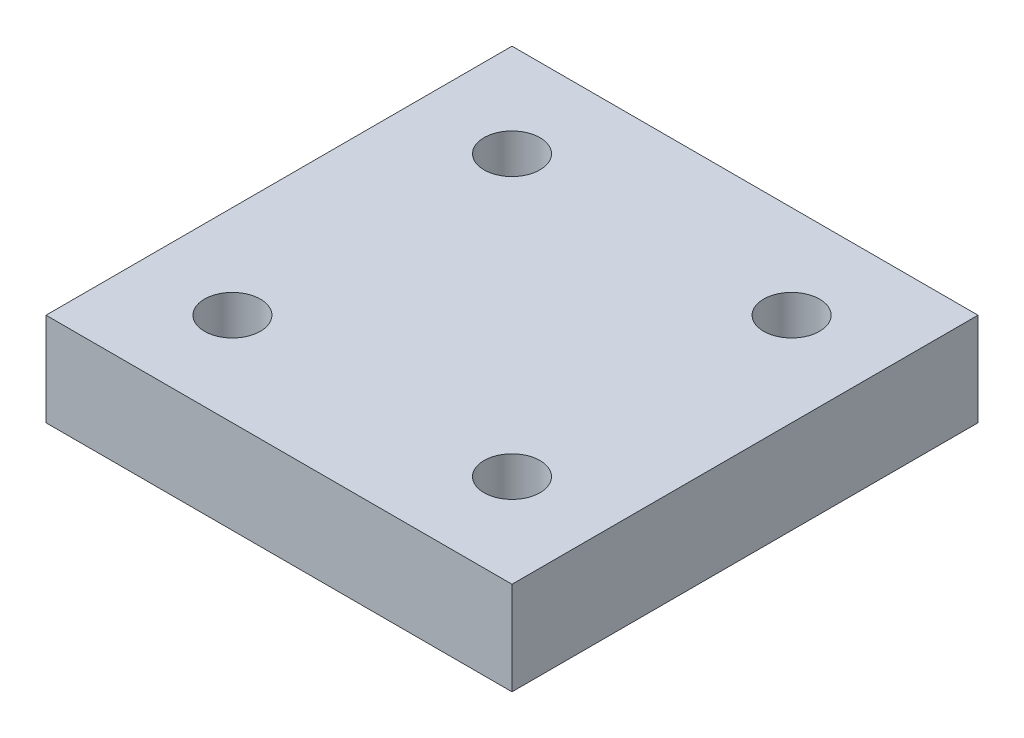
ISO-10303-21;
HEADER;
FILE_DESCRIPTION(('STEP AP214'),'2;1');
FILE_NAME('part.step','',(''),(''),'','','');
FILE_SCHEMA(('AUTOMOTIVE_DESIGN { 1 0 10303 214 1 1 1 1 }'));
ENDSEC;
DATA;
#1=APPLICATION_CONTEXT('core data for automotive mechanical design processes');
#2=APPLICATION_PROTOCOL_DEFINITION('international standard','automotive_design',2000,#1);
#3=PRODUCT_CONTEXT('',#1,'mechanical');
#4=PRODUCT('Part','Part','',(#3));
#5=PRODUCT_RELATED_PRODUCT_CATEGORY('part','',(#4));
#6=PRODUCT_DEFINITION_FORMATION('','',#4);
#7=PRODUCT_DEFINITION_CONTEXT('part definition',#1,'design');
#8=PRODUCT_DEFINITION('design','',#6,#7);
#9=PRODUCT_DEFINITION_SHAPE('','',#8);
#10=(LENGTH_UNIT() NAMED_UNIT(*) SI_UNIT(.MILLI.,.METRE.));
#11=(NAMED_UNIT(*) PLANE_ANGLE_UNIT() SI_UNIT($,.RADIAN.));
#12=(NAMED_UNIT(*) SI_UNIT($,.STERADIAN.) SOLID_ANGLE_UNIT());
#13=UNCERTAINTY_MEASURE_WITH_UNIT(LENGTH_MEASURE(1.E-05),#10,'distance_accuracy_value','');
#14=(GEOMETRIC_REPRESENTATION_CONTEXT(3) GLOBAL_UNCERTAINTY_ASSIGNED_CONTEXT((#13)) GLOBAL_UNIT_ASSIGNED_CONTEXT((#10,
#11,#12)) REPRESENTATION_CONTEXT('',''));
#15=CARTESIAN_POINT('',(0.,0.,0.));
#16=DIRECTION('',(0.,0.,1.));
#17=DIRECTION('',(1.,0.,0.));
#18=AXIS2_PLACEMENT_3D('',#15,#16,#17);
#19=CARTESIAN_POINT('',(0.,10.,0.));
#20=DIRECTION('',(0.,1.,0.));
#21=DIRECTION('',(0.,0.,1.));
#22=AXIS2_PLACEMENT_3D('',#19,#20,#21);
#23=PLANE('',#22);
#24=CARTESIAN_POINT('',(15.0000000000003,10.,15.));
#25=DIRECTION('',(0.,1.,0.));
#26=DIRECTION('',(0.,0.,1.));
#27=AXIS2_PLACEMENT_3D('',#24,#25,#26);
#28=CIRCLE('',#27,3.);
#29=CARTESIAN_POINT('',(15.0000000000003,10.,18.));
#30=VERTEX_POINT('',#29);
#31=EDGE_CURVE('E122',#30,#30,#28,.T.);
#32=ORIENTED_EDGE('',*,*,#31,.F.);
#33=EDGE_LOOP('',(#32));
#34=FACE_BOUND('',#33,.T.);
#35=CARTESIAN_POINT('',(-15.,10.,-15.));
#36=DIRECTION('',(0.,1.,0.));
#37=DIRECTION('',(0.,0.,1.));
#38=AXIS2_PLACEMENT_3D('',#35,#36,#37);
#39=CIRCLE('',#38,3.);
#40=CARTESIAN_POINT('',(-15.,10.,-12.));
#41=VERTEX_POINT('',#40);
#42=EDGE_CURVE('E101',#41,#41,#39,.T.);
#43=ORIENTED_EDGE('',*,*,#42,.F.);
#44=EDGE_LOOP('',(#43));
#45=FACE_BOUND('',#44,.T.);
#46=DIRECTION('',(0.,0.,1.));
#47=VECTOR('',#46,1.);
#48=CARTESIAN_POINT('',(-25.,10.,25.));
#49=LINE('',#48,#47);
#50=CARTESIAN_POINT('',(-25.,10.,-25.));
#51=VERTEX_POINT('',#50);
#52=CARTESIAN_POINT('',(-25.,10.,25.));
#53=VERTEX_POINT('',#52);
#54=EDGE_CURVE('E86',#51,#53,#49,.T.);
#55=ORIENTED_EDGE('',*,*,#54,.T.);
#56=DIRECTION('',(1.,0.,0.));
#57=VECTOR('',#56,1.);
#58=CARTESIAN_POINT('',(25.,10.,25.));
#59=LINE('',#58,#57);
#60=CARTESIAN_POINT('',(25.,10.,25.));
#61=VERTEX_POINT('',#60);
#62=EDGE_CURVE('E81',#53,#61,#59,.T.);
#63=ORIENTED_EDGE('',*,*,#62,.T.);
#64=DIRECTION('',(0.,0.,-1.));
#65=VECTOR('',#64,1.);
#66=CARTESIAN_POINT('',(25.,10.,25.));
#67=LINE('',#66,#65);
#68=CARTESIAN_POINT('',(25.,10.,-25.));
#69=VERTEX_POINT('',#68);
#70=EDGE_CURVE('E84',#61,#69,#67,.T.);
#71=ORIENTED_EDGE('',*,*,#70,.T.);
#72=DIRECTION('',(-1.,0.,0.));
#73=VECTOR('',#72,1.);
#74=CARTESIAN_POINT('',(25.,10.,-25.));
#75=LINE('',#74,#73);
#76=EDGE_CURVE('E51',#69,#51,#75,.T.);
#77=ORIENTED_EDGE('',*,*,#76,.T.);
#78=EDGE_LOOP('',(#55,#63,#71,#77));
#79=FACE_BOUND('',#78,.T.);
#80=CARTESIAN_POINT('',(15.,10.,-15.));
#81=DIRECTION('',(0.,1.,0.));
#82=DIRECTION('',(0.,0.,1.));
#83=AXIS2_PLACEMENT_3D('',#80,#81,#82);
#84=CIRCLE('',#83,3.);
#85=CARTESIAN_POINT('',(15.,10.,-12.));
#86=VERTEX_POINT('',#85);
#87=EDGE_CURVE('E116',#86,#86,#84,.T.);
#88=ORIENTED_EDGE('',*,*,#87,.F.);
#89=EDGE_LOOP('',(#88));
#90=FACE_BOUND('',#89,.T.);
#91=CARTESIAN_POINT('',(-14.9999999999997,10.,15.));
#92=DIRECTION('',(0.,1.,0.));
#93=DIRECTION('',(0.,0.,1.));
#94=AXIS2_PLACEMENT_3D('',#91,#92,#93);
#95=CIRCLE('',#94,3.);
#96=CARTESIAN_POINT('',(-14.9999999999997,10.,18.));
#97=VERTEX_POINT('',#96);
#98=EDGE_CURVE('E128',#97,#97,#95,.T.);
#99=ORIENTED_EDGE('',*,*,#98,.F.);
#100=EDGE_LOOP('',(#99));
#101=FACE_BOUND('',#100,.T.);
#102=ADVANCED_FACE('F34',(#34,#45,#79,#90,#101),#23,.T.);
#103=CARTESIAN_POINT('',(0.,0.,0.));
#104=DIRECTION('',(0.,1.,0.));
#105=DIRECTION('',(0.,0.,1.));
#106=AXIS2_PLACEMENT_3D('',#103,#104,#105);
#107=PLANE('',#106);
#108=DIRECTION('',(0.,0.,1.));
#109=VECTOR('',#108,1.);
#110=CARTESIAN_POINT('',(-25.,0.,25.));
#111=LINE('',#110,#109);
#112=CARTESIAN_POINT('',(-25.,0.,-25.));
#113=VERTEX_POINT('',#112);
#114=CARTESIAN_POINT('',(-25.,0.,25.));
#115=VERTEX_POINT('',#114);
#116=EDGE_CURVE('E98',#113,#115,#111,.T.);
#117=ORIENTED_EDGE('',*,*,#116,.F.);
#118=DIRECTION('',(-1.,0.,0.));
#119=VECTOR('',#118,1.);
#120=CARTESIAN_POINT('',(25.,0.,-25.));
#121=LINE('',#120,#119);
#122=CARTESIAN_POINT('',(25.,0.,-25.));
#123=VERTEX_POINT('',#122);
#124=EDGE_CURVE('E74',#123,#113,#121,.T.);
#125=ORIENTED_EDGE('',*,*,#124,.F.);
#126=DIRECTION('',(0.,0.,-1.));
#127=VECTOR('',#126,1.);
#128=CARTESIAN_POINT('',(25.,0.,25.));
#129=LINE('',#128,#127);
#130=CARTESIAN_POINT('',(25.,0.,25.));
#131=VERTEX_POINT('',#130);
#132=EDGE_CURVE('E68',#131,#123,#129,.T.);
#133=ORIENTED_EDGE('',*,*,#132,.F.);
#134=DIRECTION('',(1.,0.,0.));
#135=VECTOR('',#134,1.);
#136=CARTESIAN_POINT('',(25.,0.,25.));
#137=LINE('',#136,#135);
#138=EDGE_CURVE('E90',#115,#131,#137,.T.);
#139=ORIENTED_EDGE('',*,*,#138,.F.);
#140=EDGE_LOOP('',(#117,#125,#133,#139));
#141=FACE_BOUND('',#140,.T.);
#142=CARTESIAN_POINT('',(-15.,0.,-15.));
#143=DIRECTION('',(0.,1.,0.));
#144=DIRECTION('',(0.,0.,1.));
#145=AXIS2_PLACEMENT_3D('',#142,#143,#144);
#146=CIRCLE('',#145,3.);
#147=CARTESIAN_POINT('',(-15.,0.,-12.));
#148=VERTEX_POINT('',#147);
#149=EDGE_CURVE('E113',#148,#148,#146,.T.);
#150=ORIENTED_EDGE('',*,*,#149,.T.);
#151=EDGE_LOOP('',(#150));
#152=FACE_BOUND('',#151,.T.);
#153=CARTESIAN_POINT('',(15.,0.,-15.));
#154=DIRECTION('',(0.,1.,0.));
#155=DIRECTION('',(0.,0.,1.));
#156=AXIS2_PLACEMENT_3D('',#153,#154,#155);
#157=CIRCLE('',#156,3.);
#158=CARTESIAN_POINT('',(15.,0.,-12.));
#159=VERTEX_POINT('',#158);
#160=EDGE_CURVE('E119',#159,#159,#157,.T.);
#161=ORIENTED_EDGE('',*,*,#160,.T.);
#162=EDGE_LOOP('',(#161));
#163=FACE_BOUND('',#162,.T.);
#164=CARTESIAN_POINT('',(15.0000000000003,0.,15.));
#165=DIRECTION('',(0.,1.,0.));
#166=DIRECTION('',(0.,0.,1.));
#167=AXIS2_PLACEMENT_3D('',#164,#165,#166);
#168=CIRCLE('',#167,3.);
#169=CARTESIAN_POINT('',(15.0000000000003,0.,18.));
#170=VERTEX_POINT('',#169);
#171=EDGE_CURVE('E125',#170,#170,#168,.T.);
#172=ORIENTED_EDGE('',*,*,#171,.T.);
#173=EDGE_LOOP('',(#172));
#174=FACE_BOUND('',#173,.T.);
#175=CARTESIAN_POINT('',(-14.9999999999997,0.,15.));
#176=DIRECTION('',(0.,1.,0.));
#177=DIRECTION('',(0.,0.,1.));
#178=AXIS2_PLACEMENT_3D('',#175,#176,#177);
#179=CIRCLE('',#178,3.);
#180=CARTESIAN_POINT('',(-14.9999999999997,0.,18.));
#181=VERTEX_POINT('',#180);
#182=EDGE_CURVE('E131',#181,#181,#179,.T.);
#183=ORIENTED_EDGE('',*,*,#182,.T.);
#184=EDGE_LOOP('',(#183));
#185=FACE_BOUND('',#184,.T.);
#186=ADVANCED_FACE('F109',(#141,#152,#163,#174,#185),#107,.F.);
#187=CARTESIAN_POINT('',(-25.,10.,25.));
#188=DIRECTION('',(1.,0.,0.));
#189=DIRECTION('',(0.,0.,-1.));
#190=AXIS2_PLACEMENT_3D('',#187,#188,#189);
#191=PLANE('',#190);
#192=ORIENTED_EDGE('',*,*,#116,.T.);
#193=DIRECTION('',(0.,-1.,0.));
#194=VECTOR('',#193,1.);
#195=CARTESIAN_POINT('',(-25.,10.,25.));
#196=LINE('',#195,#194);
#197=EDGE_CURVE('E11',#53,#115,#196,.T.);
#198=ORIENTED_EDGE('',*,*,#197,.F.);
#199=ORIENTED_EDGE('',*,*,#54,.F.);
#200=DIRECTION('',(0.,-1.,0.));
#201=VECTOR('',#200,1.);
#202=CARTESIAN_POINT('',(-25.,10.,-25.));
#203=LINE('',#202,#201);
#204=EDGE_CURVE('E94',#51,#113,#203,.T.);
#205=ORIENTED_EDGE('',*,*,#204,.T.);
#206=EDGE_LOOP('',(#192,#198,#199,#205));
#207=FACE_BOUND('',#206,.T.);
#208=ADVANCED_FACE('F36',(#207),#191,.F.);
#209=CARTESIAN_POINT('',(25.,10.,25.));
#210=DIRECTION('',(0.,0.,-1.));
#211=DIRECTION('',(-1.,0.,0.));
#212=AXIS2_PLACEMENT_3D('',#209,#210,#211);
#213=PLANE('',#212);
#214=ORIENTED_EDGE('',*,*,#138,.T.);
#215=DIRECTION('',(0.,-1.,0.));
#216=VECTOR('',#215,1.);
#217=CARTESIAN_POINT('',(25.,10.,25.));
#218=LINE('',#217,#216);
#219=EDGE_CURVE('E43',#61,#131,#218,.T.);
#220=ORIENTED_EDGE('',*,*,#219,.F.);
#221=ORIENTED_EDGE('',*,*,#62,.F.);
#222=ORIENTED_EDGE('',*,*,#197,.T.);
#223=EDGE_LOOP('',(#214,#220,#221,#222));
#224=FACE_BOUND('',#223,.T.);
#225=ADVANCED_FACE('F89',(#224),#213,.F.);
#226=CARTESIAN_POINT('',(25.,10.,25.));
#227=DIRECTION('',(-1.,0.,0.));
#228=DIRECTION('',(0.,0.,1.));
#229=AXIS2_PLACEMENT_3D('',#226,#227,#228);
#230=PLANE('',#229);
#231=ORIENTED_EDGE('',*,*,#132,.T.);
#232=DIRECTION('',(0.,-1.,0.));
#233=VECTOR('',#232,1.);
#234=CARTESIAN_POINT('',(25.,10.,-25.));
#235=LINE('',#234,#233);
#236=EDGE_CURVE('E91',#69,#123,#235,.T.);
#237=ORIENTED_EDGE('',*,*,#236,.F.);
#238=ORIENTED_EDGE('',*,*,#70,.F.);
#239=ORIENTED_EDGE('',*,*,#219,.T.);
#240=EDGE_LOOP('',(#231,#237,#238,#239));
#241=FACE_BOUND('',#240,.T.);
#242=ADVANCED_FACE('F92',(#241),#230,.F.);
#243=CARTESIAN_POINT('',(25.,10.,-25.));
#244=DIRECTION('',(0.,0.,1.));
#245=DIRECTION('',(1.,0.,0.));
#246=AXIS2_PLACEMENT_3D('',#243,#244,#245);
#247=PLANE('',#246);
#248=ORIENTED_EDGE('',*,*,#124,.T.);
#249=ORIENTED_EDGE('',*,*,#204,.F.);
#250=ORIENTED_EDGE('',*,*,#76,.F.);
#251=ORIENTED_EDGE('',*,*,#236,.T.);
#252=EDGE_LOOP('',(#248,#249,#250,#251));
#253=FACE_BOUND('',#252,.T.);
#254=ADVANCED_FACE('F106',(#253),#247,.F.);
#255=CARTESIAN_POINT('',(-15.,10.,-15.));
#256=DIRECTION('',(0.,-1.,0.));
#257=DIRECTION('',(0.,0.,-1.));
#258=AXIS2_PLACEMENT_3D('',#255,#256,#257);
#259=CYLINDRICAL_SURFACE('',#258,3.);
#260=ORIENTED_EDGE('',*,*,#42,.T.);
#261=EDGE_LOOP('',(#260));
#262=FACE_BOUND('',#261,.T.);
#263=ORIENTED_EDGE('',*,*,#149,.F.);
#264=EDGE_LOOP('',(#263));
#265=FACE_BOUND('',#264,.T.);
#266=ADVANCED_FACE('F150',(#262,#265),#259,.F.);
#267=CARTESIAN_POINT('',(15.,10.,-15.));
#268=DIRECTION('',(0.,-1.,0.));
#269=DIRECTION('',(0.,0.,-1.));
#270=AXIS2_PLACEMENT_3D('',#267,#268,#269);
#271=CYLINDRICAL_SURFACE('',#270,3.);
#272=ORIENTED_EDGE('',*,*,#87,.T.);
#273=EDGE_LOOP('',(#272));
#274=FACE_BOUND('',#273,.T.);
#275=ORIENTED_EDGE('',*,*,#160,.F.);
#276=EDGE_LOOP('',(#275));
#277=FACE_BOUND('',#276,.T.);
#278=ADVANCED_FACE('F196',(#274,#277),#271,.F.);
#279=CARTESIAN_POINT('',(15.0000000000003,10.,15.));
#280=DIRECTION('',(0.,-1.,0.));
#281=DIRECTION('',(0.,0.,-1.));
#282=AXIS2_PLACEMENT_3D('',#279,#280,#281);
#283=CYLINDRICAL_SURFACE('',#282,3.);
#284=ORIENTED_EDGE('',*,*,#31,.T.);
#285=EDGE_LOOP('',(#284));
#286=FACE_BOUND('',#285,.T.);
#287=ORIENTED_EDGE('',*,*,#171,.F.);
#288=EDGE_LOOP('',(#287));
#289=FACE_BOUND('',#288,.T.);
#290=ADVANCED_FACE('F204',(#286,#289),#283,.F.);
#291=CARTESIAN_POINT('',(-14.9999999999997,10.,15.));
#292=DIRECTION('',(0.,-1.,0.));
#293=DIRECTION('',(0.,0.,-1.));
#294=AXIS2_PLACEMENT_3D('',#291,#292,#293);
#295=CYLINDRICAL_SURFACE('',#294,3.);
#296=ORIENTED_EDGE('',*,*,#98,.T.);
#297=EDGE_LOOP('',(#296));
#298=FACE_BOUND('',#297,.T.);
#299=ORIENTED_EDGE('',*,*,#182,.F.);
#300=EDGE_LOOP('',(#299));
#301=FACE_BOUND('',#300,.T.);
#302=ADVANCED_FACE('F137',(#298,#301),#295,.F.);
#303=CLOSED_SHELL('',(#102,#186,#208,#225,#242,#254,#266,#278,#290,#302));
#304=MANIFOLD_SOLID_BREP('B2',#303);
#305=ADVANCED_BREP_SHAPE_REPRESENTATION('',(#18,#304),#14);
#306=SHAPE_DEFINITION_REPRESENTATION(#9,#305);
ENDSEC;
END-ISO-10303-21;
